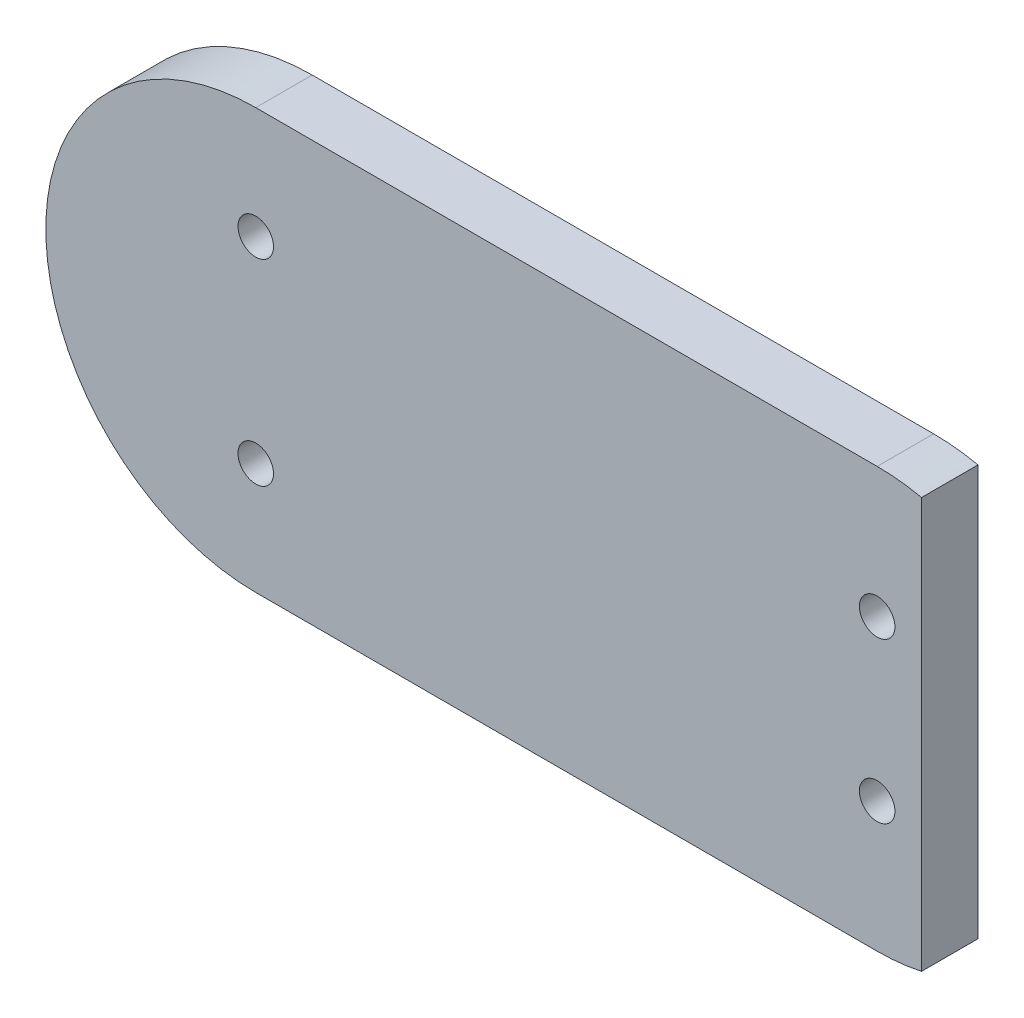
ISO-10303-21;
HEADER;
FILE_DESCRIPTION(('STEP AP214'),'2;1');
FILE_NAME('part.step','',(''),(''),'','','');
FILE_SCHEMA(('AUTOMOTIVE_DESIGN { 1 0 10303 214 1 1 1 1 }'));
ENDSEC;
DATA;
#1=APPLICATION_CONTEXT('core data for automotive mechanical design processes');
#2=APPLICATION_PROTOCOL_DEFINITION('international standard','automotive_design',2000,#1);
#3=PRODUCT_CONTEXT('',#1,'mechanical');
#4=PRODUCT('Part','Part','',(#3));
#5=PRODUCT_RELATED_PRODUCT_CATEGORY('part','',(#4));
#6=PRODUCT_DEFINITION_FORMATION('','',#4);
#7=PRODUCT_DEFINITION_CONTEXT('part definition',#1,'design');
#8=PRODUCT_DEFINITION('design','',#6,#7);
#9=PRODUCT_DEFINITION_SHAPE('','',#8);
#10=(LENGTH_UNIT() NAMED_UNIT(*) SI_UNIT(.MILLI.,.METRE.));
#11=(NAMED_UNIT(*) PLANE_ANGLE_UNIT() SI_UNIT($,.RADIAN.));
#12=(NAMED_UNIT(*) SI_UNIT($,.STERADIAN.) SOLID_ANGLE_UNIT());
#13=UNCERTAINTY_MEASURE_WITH_UNIT(LENGTH_MEASURE(1.E-05),#10,'distance_accuracy_value','');
#14=(GEOMETRIC_REPRESENTATION_CONTEXT(3) GLOBAL_UNCERTAINTY_ASSIGNED_CONTEXT((#13)) GLOBAL_UNIT_ASSIGNED_CONTEXT((#10,
#11,#12)) REPRESENTATION_CONTEXT('',''));
#15=CARTESIAN_POINT('',(0.,0.,0.));
#16=DIRECTION('',(0.,0.,1.));
#17=DIRECTION('',(1.,0.,0.));
#18=AXIS2_PLACEMENT_3D('',#15,#16,#17);
#19=CARTESIAN_POINT('',(17.5,0.,1.59));
#20=DIRECTION('',(0.,0.,-1.));
#21=DIRECTION('',(-1.,0.,0.));
#22=AXIS2_PLACEMENT_3D('',#19,#20,#21);
#23=CYLINDRICAL_SURFACE('',#22,11.825);
#24=CARTESIAN_POINT('',(17.5,0.,1.59));
#25=DIRECTION('',(0.,0.,1.));
#26=DIRECTION('',(1.,0.,0.));
#27=AXIS2_PLACEMENT_3D('',#24,#25,#26);
#28=CIRCLE('',#27,11.825);
#29=CARTESIAN_POINT('',(20.,11.5577084666468,1.59));
#30=VERTEX_POINT('',#29);
#31=CARTESIAN_POINT('',(17.5,11.825,1.59));
#32=VERTEX_POINT('',#31);
#33=EDGE_CURVE('E113',#30,#32,#28,.T.);
#34=ORIENTED_EDGE('',*,*,#33,.F.);
#35=DIRECTION('',(0.,0.,1.));
#36=VECTOR('',#35,1.);
#37=CARTESIAN_POINT('',(20.,11.5577084666468,-1.59));
#38=LINE('',#37,#36);
#39=CARTESIAN_POINT('',(20.,11.5577084666468,-1.59));
#40=VERTEX_POINT('',#39);
#41=EDGE_CURVE('E101',#40,#30,#38,.T.);
#42=ORIENTED_EDGE('',*,*,#41,.F.);
#43=CARTESIAN_POINT('',(17.5,0.,-1.59));
#44=DIRECTION('',(0.,0.,1.));
#45=DIRECTION('',(1.,0.,0.));
#46=AXIS2_PLACEMENT_3D('',#43,#44,#45);
#47=CIRCLE('',#46,11.825);
#48=CARTESIAN_POINT('',(17.5,11.825,-1.59));
#49=VERTEX_POINT('',#48);
#50=EDGE_CURVE('E112',#40,#49,#47,.T.);
#51=ORIENTED_EDGE('',*,*,#50,.T.);
#52=DIRECTION('',(0.,0.,-1.));
#53=VECTOR('',#52,1.);
#54=CARTESIAN_POINT('',(17.5,11.825,1.59));
#55=LINE('',#54,#53);
#56=EDGE_CURVE('E128',#32,#49,#55,.T.);
#57=ORIENTED_EDGE('',*,*,#56,.F.);
#58=EDGE_LOOP('',(#34,#42,#51,#57));
#59=FACE_BOUND('',#58,.T.);
#60=ADVANCED_FACE('F37',(#59),#23,.T.);
#61=CARTESIAN_POINT('',(-17.5,0.,1.59));
#62=DIRECTION('',(0.,0.,-1.));
#63=DIRECTION('',(-1.,0.,0.));
#64=AXIS2_PLACEMENT_3D('',#61,#62,#63);
#65=CYLINDRICAL_SURFACE('',#64,11.825);
#66=CARTESIAN_POINT('',(-17.5,0.,-1.59));
#67=DIRECTION('',(0.,0.,1.));
#68=DIRECTION('',(1.,0.,0.));
#69=AXIS2_PLACEMENT_3D('',#66,#67,#68);
#70=CIRCLE('',#69,11.825);
#71=CARTESIAN_POINT('',(-17.5,11.825,-1.59));
#72=VERTEX_POINT('',#71);
#73=CARTESIAN_POINT('',(-17.5,-11.825,-1.59));
#74=VERTEX_POINT('',#73);
#75=EDGE_CURVE('E120',#72,#74,#70,.T.);
#76=ORIENTED_EDGE('',*,*,#75,.T.);
#77=DIRECTION('',(0.,0.,-1.));
#78=VECTOR('',#77,1.);
#79=CARTESIAN_POINT('',(-17.5,-11.825,1.59));
#80=LINE('',#79,#78);
#81=CARTESIAN_POINT('',(-17.5,-11.825,1.59));
#82=VERTEX_POINT('',#81);
#83=EDGE_CURVE('E11',#82,#74,#80,.T.);
#84=ORIENTED_EDGE('',*,*,#83,.F.);
#85=CARTESIAN_POINT('',(-17.5,0.,1.59));
#86=DIRECTION('',(0.,0.,1.));
#87=DIRECTION('',(1.,0.,0.));
#88=AXIS2_PLACEMENT_3D('',#85,#86,#87);
#89=CIRCLE('',#88,11.825);
#90=CARTESIAN_POINT('',(-17.5,11.825,1.59));
#91=VERTEX_POINT('',#90);
#92=EDGE_CURVE('E125',#91,#82,#89,.T.);
#93=ORIENTED_EDGE('',*,*,#92,.F.);
#94=DIRECTION('',(0.,0.,-1.));
#95=VECTOR('',#94,1.);
#96=CARTESIAN_POINT('',(-17.5,11.825,1.59));
#97=LINE('',#96,#95);
#98=EDGE_CURVE('E126',#91,#72,#97,.T.);
#99=ORIENTED_EDGE('',*,*,#98,.T.);
#100=EDGE_LOOP('',(#76,#84,#93,#99));
#101=FACE_BOUND('',#100,.T.);
#102=ADVANCED_FACE('F39',(#101),#65,.T.);
#103=CARTESIAN_POINT('',(-17.5,-11.825,1.59));
#104=DIRECTION('',(0.,1.,0.));
#105=DIRECTION('',(0.,0.,1.));
#106=AXIS2_PLACEMENT_3D('',#103,#104,#105);
#107=PLANE('',#106);
#108=DIRECTION('',(1.,0.,0.));
#109=VECTOR('',#108,1.);
#110=CARTESIAN_POINT('',(-17.5,-11.825,-1.59));
#111=LINE('',#110,#109);
#112=CARTESIAN_POINT('',(17.5,-11.825,-1.59));
#113=VERTEX_POINT('',#112);
#114=EDGE_CURVE('E118',#74,#113,#111,.T.);
#115=ORIENTED_EDGE('',*,*,#114,.T.);
#116=DIRECTION('',(0.,0.,-1.));
#117=VECTOR('',#116,1.);
#118=CARTESIAN_POINT('',(17.5,-11.825,1.59));
#119=LINE('',#118,#117);
#120=CARTESIAN_POINT('',(17.5,-11.825,1.59));
#121=VERTEX_POINT('',#120);
#122=EDGE_CURVE('E46',#121,#113,#119,.T.);
#123=ORIENTED_EDGE('',*,*,#122,.F.);
#124=DIRECTION('',(1.,0.,0.));
#125=VECTOR('',#124,1.);
#126=CARTESIAN_POINT('',(-17.5,-11.825,1.59));
#127=LINE('',#126,#125);
#128=EDGE_CURVE('E91',#82,#121,#127,.T.);
#129=ORIENTED_EDGE('',*,*,#128,.F.);
#130=ORIENTED_EDGE('',*,*,#83,.T.);
#131=EDGE_LOOP('',(#115,#123,#129,#130));
#132=FACE_BOUND('',#131,.T.);
#133=ADVANCED_FACE('F158',(#132),#107,.F.);
#134=CARTESIAN_POINT('',(20.,-11.5577084666468,-1.59));
#135=VERTEX_POINT('',#134);
#136=EDGE_CURVE('E117',#113,#135,#47,.T.);
#137=ORIENTED_EDGE('',*,*,#136,.T.);
#138=DIRECTION('',(0.,0.,1.));
#139=VECTOR('',#138,1.);
#140=CARTESIAN_POINT('',(20.,-11.5577084666468,-1.59));
#141=LINE('',#140,#139);
#142=CARTESIAN_POINT('',(20.,-11.5577084666468,1.59));
#143=VERTEX_POINT('',#142);
#144=EDGE_CURVE('E54',#135,#143,#141,.T.);
#145=ORIENTED_EDGE('',*,*,#144,.T.);
#146=EDGE_CURVE('E151',#121,#143,#28,.T.);
#147=ORIENTED_EDGE('',*,*,#146,.F.);
#148=ORIENTED_EDGE('',*,*,#122,.T.);
#149=EDGE_LOOP('',(#137,#145,#147,#148));
#150=FACE_BOUND('',#149,.T.);
#151=ADVANCED_FACE('F160',(#150),#23,.T.);
#152=CARTESIAN_POINT('',(-17.5,11.825,1.59));
#153=DIRECTION('',(0.,-1.,0.));
#154=DIRECTION('',(0.,0.,-1.));
#155=AXIS2_PLACEMENT_3D('',#152,#153,#154);
#156=PLANE('',#155);
#157=DIRECTION('',(-1.,0.,0.));
#158=VECTOR('',#157,1.);
#159=CARTESIAN_POINT('',(-17.5,11.825,-1.59));
#160=LINE('',#159,#158);
#161=EDGE_CURVE('E84',#49,#72,#160,.T.);
#162=ORIENTED_EDGE('',*,*,#161,.T.);
#163=ORIENTED_EDGE('',*,*,#98,.F.);
#164=DIRECTION('',(-1.,0.,0.));
#165=VECTOR('',#164,1.);
#166=CARTESIAN_POINT('',(-17.5,11.825,1.59));
#167=LINE('',#166,#165);
#168=EDGE_CURVE('E63',#32,#91,#167,.T.);
#169=ORIENTED_EDGE('',*,*,#168,.F.);
#170=ORIENTED_EDGE('',*,*,#56,.T.);
#171=EDGE_LOOP('',(#162,#163,#169,#170));
#172=FACE_BOUND('',#171,.T.);
#173=ADVANCED_FACE('F165',(#172),#156,.F.);
#174=CARTESIAN_POINT('',(-17.5,0.,1.59));
#175=DIRECTION('',(0.,0.,1.));
#176=DIRECTION('',(1.,0.,0.));
#177=AXIS2_PLACEMENT_3D('',#174,#175,#176);
#178=PLANE('',#177);
#179=DIRECTION('',(0.,-1.,0.));
#180=VECTOR('',#179,1.);
#181=CARTESIAN_POINT('',(20.,11.5577084666468,1.59));
#182=LINE('',#181,#180);
#183=EDGE_CURVE('E107',#30,#143,#182,.T.);
#184=ORIENTED_EDGE('',*,*,#183,.F.);
#185=ORIENTED_EDGE('',*,*,#33,.T.);
#186=ORIENTED_EDGE('',*,*,#168,.T.);
#187=ORIENTED_EDGE('',*,*,#92,.T.);
#188=ORIENTED_EDGE('',*,*,#128,.T.);
#189=ORIENTED_EDGE('',*,*,#146,.T.);
#190=EDGE_LOOP('',(#184,#185,#186,#187,#188,#189));
#191=FACE_BOUND('',#190,.T.);
#192=CARTESIAN_POINT('',(17.5,-4.5,1.59));
#193=DIRECTION('',(0.,0.,1.));
#194=DIRECTION('',(1.,0.,0.));
#195=AXIS2_PLACEMENT_3D('',#192,#193,#194);
#196=CIRCLE('',#195,1.);
#197=CARTESIAN_POINT('',(18.5,-4.5,1.59));
#198=VERTEX_POINT('',#197);
#199=EDGE_CURVE('E204',#198,#198,#196,.T.);
#200=ORIENTED_EDGE('',*,*,#199,.F.);
#201=EDGE_LOOP('',(#200));
#202=FACE_BOUND('',#201,.T.);
#203=CARTESIAN_POINT('',(17.5,4.5,1.59));
#204=DIRECTION('',(0.,0.,1.));
#205=DIRECTION('',(1.,0.,0.));
#206=AXIS2_PLACEMENT_3D('',#203,#204,#205);
#207=CIRCLE('',#206,1.);
#208=CARTESIAN_POINT('',(18.5,4.5,1.59));
#209=VERTEX_POINT('',#208);
#210=EDGE_CURVE('E146',#209,#209,#207,.T.);
#211=ORIENTED_EDGE('',*,*,#210,.F.);
#212=EDGE_LOOP('',(#211));
#213=FACE_BOUND('',#212,.T.);
#214=CARTESIAN_POINT('',(-17.5,5.535,1.59));
#215=DIRECTION('',(0.,0.,1.));
#216=DIRECTION('',(1.,0.,0.));
#217=AXIS2_PLACEMENT_3D('',#214,#215,#216);
#218=CIRCLE('',#217,1.);
#219=CARTESIAN_POINT('',(-16.5,5.535,1.59));
#220=VERTEX_POINT('',#219);
#221=EDGE_CURVE('E133',#220,#220,#218,.T.);
#222=ORIENTED_EDGE('',*,*,#221,.F.);
#223=EDGE_LOOP('',(#222));
#224=FACE_BOUND('',#223,.T.);
#225=CARTESIAN_POINT('',(-17.5,-5.535,1.59));
#226=DIRECTION('',(0.,0.,1.));
#227=DIRECTION('',(1.,0.,0.));
#228=AXIS2_PLACEMENT_3D('',#225,#226,#227);
#229=CIRCLE('',#228,1.);
#230=CARTESIAN_POINT('',(-16.5,-5.535,1.59));
#231=VERTEX_POINT('',#230);
#232=EDGE_CURVE('E138',#231,#231,#229,.T.);
#233=ORIENTED_EDGE('',*,*,#232,.F.);
#234=EDGE_LOOP('',(#233));
#235=FACE_BOUND('',#234,.T.);
#236=ADVANCED_FACE('F174',(#191,#202,#213,#224,#235),#178,.T.);
#237=CARTESIAN_POINT('',(-17.5,0.,-1.59));
#238=DIRECTION('',(0.,0.,1.));
#239=DIRECTION('',(1.,0.,0.));
#240=AXIS2_PLACEMENT_3D('',#237,#238,#239);
#241=PLANE('',#240);
#242=CARTESIAN_POINT('',(17.5,-4.5,-1.59));
#243=DIRECTION('',(0.,0.,1.));
#244=DIRECTION('',(1.,0.,0.));
#245=AXIS2_PLACEMENT_3D('',#242,#243,#244);
#246=CIRCLE('',#245,1.);
#247=CARTESIAN_POINT('',(18.5,-4.5,-1.59));
#248=VERTEX_POINT('',#247);
#249=EDGE_CURVE('E201',#248,#248,#246,.T.);
#250=ORIENTED_EDGE('',*,*,#249,.T.);
#251=EDGE_LOOP('',(#250));
#252=FACE_BOUND('',#251,.T.);
#253=CARTESIAN_POINT('',(17.5,4.5,-1.59));
#254=DIRECTION('',(0.,0.,1.));
#255=DIRECTION('',(1.,0.,0.));
#256=AXIS2_PLACEMENT_3D('',#253,#254,#255);
#257=CIRCLE('',#256,1.);
#258=CARTESIAN_POINT('',(18.5,4.5,-1.59));
#259=VERTEX_POINT('',#258);
#260=EDGE_CURVE('E143',#259,#259,#257,.T.);
#261=ORIENTED_EDGE('',*,*,#260,.T.);
#262=EDGE_LOOP('',(#261));
#263=FACE_BOUND('',#262,.T.);
#264=CARTESIAN_POINT('',(-17.5,5.535,-1.59));
#265=DIRECTION('',(0.,0.,1.));
#266=DIRECTION('',(1.,0.,0.));
#267=AXIS2_PLACEMENT_3D('',#264,#265,#266);
#268=CIRCLE('',#267,1.);
#269=CARTESIAN_POINT('',(-16.5,5.535,-1.59));
#270=VERTEX_POINT('',#269);
#271=EDGE_CURVE('E41',#270,#270,#268,.T.);
#272=ORIENTED_EDGE('',*,*,#271,.T.);
#273=EDGE_LOOP('',(#272));
#274=FACE_BOUND('',#273,.T.);
#275=CARTESIAN_POINT('',(-17.5,-5.535,-1.59));
#276=DIRECTION('',(0.,0.,1.));
#277=DIRECTION('',(1.,0.,0.));
#278=AXIS2_PLACEMENT_3D('',#275,#276,#277);
#279=CIRCLE('',#278,1.);
#280=CARTESIAN_POINT('',(-16.5,-5.535,-1.59));
#281=VERTEX_POINT('',#280);
#282=EDGE_CURVE('E131',#281,#281,#279,.T.);
#283=ORIENTED_EDGE('',*,*,#282,.T.);
#284=EDGE_LOOP('',(#283));
#285=FACE_BOUND('',#284,.T.);
#286=ORIENTED_EDGE('',*,*,#50,.F.);
#287=DIRECTION('',(0.,-1.,0.));
#288=VECTOR('',#287,1.);
#289=CARTESIAN_POINT('',(20.,11.5577084666468,-1.59));
#290=LINE('',#289,#288);
#291=EDGE_CURVE('E98',#40,#135,#290,.T.);
#292=ORIENTED_EDGE('',*,*,#291,.T.);
#293=ORIENTED_EDGE('',*,*,#136,.F.);
#294=ORIENTED_EDGE('',*,*,#114,.F.);
#295=ORIENTED_EDGE('',*,*,#75,.F.);
#296=ORIENTED_EDGE('',*,*,#161,.F.);
#297=EDGE_LOOP('',(#286,#292,#293,#294,#295,#296));
#298=FACE_BOUND('',#297,.T.);
#299=ADVANCED_FACE('F115',(#252,#263,#274,#285,#298),#241,.F.);
#300=CARTESIAN_POINT('',(-17.5,-5.535,-8.41));
#301=DIRECTION('',(0.,0.,1.));
#302=DIRECTION('',(1.,0.,0.));
#303=AXIS2_PLACEMENT_3D('',#300,#301,#302);
#304=CYLINDRICAL_SURFACE('',#303,1.);
#305=ORIENTED_EDGE('',*,*,#232,.T.);
#306=EDGE_LOOP('',(#305));
#307=FACE_BOUND('',#306,.T.);
#308=ORIENTED_EDGE('',*,*,#282,.F.);
#309=EDGE_LOOP('',(#308));
#310=FACE_BOUND('',#309,.T.);
#311=ADVANCED_FACE('F177',(#307,#310),#304,.F.);
#312=CARTESIAN_POINT('',(-17.5,5.535,-8.41));
#313=DIRECTION('',(0.,0.,1.));
#314=DIRECTION('',(1.,0.,0.));
#315=AXIS2_PLACEMENT_3D('',#312,#313,#314);
#316=CYLINDRICAL_SURFACE('',#315,1.);
#317=ORIENTED_EDGE('',*,*,#221,.T.);
#318=EDGE_LOOP('',(#317));
#319=FACE_BOUND('',#318,.T.);
#320=ORIENTED_EDGE('',*,*,#271,.F.);
#321=EDGE_LOOP('',(#320));
#322=FACE_BOUND('',#321,.T.);
#323=ADVANCED_FACE('F183',(#319,#322),#316,.F.);
#324=CARTESIAN_POINT('',(17.5,4.5,-1.59));
#325=DIRECTION('',(0.,0.,1.));
#326=DIRECTION('',(1.,0.,0.));
#327=AXIS2_PLACEMENT_3D('',#324,#325,#326);
#328=CYLINDRICAL_SURFACE('',#327,1.);
#329=ORIENTED_EDGE('',*,*,#260,.F.);
#330=EDGE_LOOP('',(#329));
#331=FACE_BOUND('',#330,.T.);
#332=ORIENTED_EDGE('',*,*,#210,.T.);
#333=EDGE_LOOP('',(#332));
#334=FACE_BOUND('',#333,.T.);
#335=ADVANCED_FACE('F187',(#331,#334),#328,.F.);
#336=CARTESIAN_POINT('',(17.5,-4.5,-1.59));
#337=DIRECTION('',(0.,0.,1.));
#338=DIRECTION('',(1.,0.,0.));
#339=AXIS2_PLACEMENT_3D('',#336,#337,#338);
#340=CYLINDRICAL_SURFACE('',#339,1.);
#341=ORIENTED_EDGE('',*,*,#249,.F.);
#342=EDGE_LOOP('',(#341));
#343=FACE_BOUND('',#342,.T.);
#344=ORIENTED_EDGE('',*,*,#199,.T.);
#345=EDGE_LOOP('',(#344));
#346=FACE_BOUND('',#345,.T.);
#347=ADVANCED_FACE('F190',(#343,#346),#340,.F.);
#348=CARTESIAN_POINT('',(20.,11.5577084666468,-1.59));
#349=DIRECTION('',(-1.,0.,0.));
#350=DIRECTION('',(0.,0.,1.));
#351=AXIS2_PLACEMENT_3D('',#348,#349,#350);
#352=PLANE('',#351);
#353=ORIENTED_EDGE('',*,*,#183,.T.);
#354=ORIENTED_EDGE('',*,*,#144,.F.);
#355=ORIENTED_EDGE('',*,*,#291,.F.);
#356=ORIENTED_EDGE('',*,*,#41,.T.);
#357=EDGE_LOOP('',(#353,#354,#355,#356));
#358=FACE_BOUND('',#357,.T.);
#359=ADVANCED_FACE('F100',(#358),#352,.F.);
#360=CLOSED_SHELL('',(#60,#102,#133,#151,#173,#236,#299,#311,#323,#335,#347,#359));
#361=MANIFOLD_SOLID_BREP('B2',#360);
#362=ADVANCED_BREP_SHAPE_REPRESENTATION('',(#18,#361),#14);
#363=SHAPE_DEFINITION_REPRESENTATION(#9,#362);
ENDSEC;
END-ISO-10303-21;
